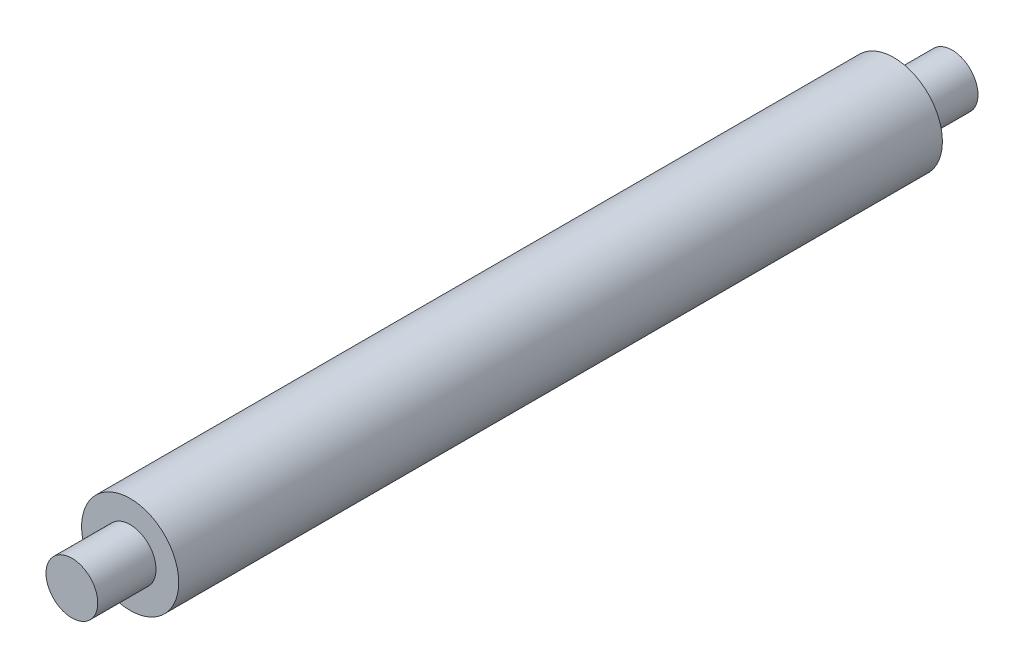
ISO-10303-21;
HEADER;
FILE_DESCRIPTION(('STEP AP214'),'2;1');
FILE_NAME('part.step','',(''),(''),'','','');
FILE_SCHEMA(('AUTOMOTIVE_DESIGN { 1 0 10303 214 1 1 1 1 }'));
ENDSEC;
DATA;
#1=APPLICATION_CONTEXT('core data for automotive mechanical design processes');
#2=APPLICATION_PROTOCOL_DEFINITION('international standard','automotive_design',2000,#1);
#3=PRODUCT_CONTEXT('',#1,'mechanical');
#4=PRODUCT('Part','Part','',(#3));
#5=PRODUCT_RELATED_PRODUCT_CATEGORY('part','',(#4));
#6=PRODUCT_DEFINITION_FORMATION('','',#4);
#7=PRODUCT_DEFINITION_CONTEXT('part definition',#1,'design');
#8=PRODUCT_DEFINITION('design','',#6,#7);
#9=PRODUCT_DEFINITION_SHAPE('','',#8);
#10=(LENGTH_UNIT() NAMED_UNIT(*) SI_UNIT(.MILLI.,.METRE.));
#11=(NAMED_UNIT(*) PLANE_ANGLE_UNIT() SI_UNIT($,.RADIAN.));
#12=(NAMED_UNIT(*) SI_UNIT($,.STERADIAN.) SOLID_ANGLE_UNIT());
#13=UNCERTAINTY_MEASURE_WITH_UNIT(LENGTH_MEASURE(1.E-05),#10,'distance_accuracy_value','');
#14=(GEOMETRIC_REPRESENTATION_CONTEXT(3) GLOBAL_UNCERTAINTY_ASSIGNED_CONTEXT((#13)) GLOBAL_UNIT_ASSIGNED_CONTEXT((#10,
#11,#12)) REPRESENTATION_CONTEXT('',''));
#15=CARTESIAN_POINT('',(0.,0.,0.));
#16=DIRECTION('',(0.,0.,1.));
#17=DIRECTION('',(1.,0.,0.));
#18=AXIS2_PLACEMENT_3D('',#15,#16,#17);
#19=CARTESIAN_POINT('',(0.,0.,295.));
#20=DIRECTION('',(0.,0.,-1.));
#21=DIRECTION('',(-1.,0.,0.));
#22=AXIS2_PLACEMENT_3D('',#19,#20,#21);
#23=CYLINDRICAL_SURFACE('',#22,37.5);
#24=CARTESIAN_POINT('',(0.,0.,295.));
#25=DIRECTION('',(0.,0.,1.));
#26=DIRECTION('',(1.,0.,0.));
#27=AXIS2_PLACEMENT_3D('',#24,#25,#26);
#28=CIRCLE('',#27,37.5);
#29=CARTESIAN_POINT('',(37.5,0.,295.));
#30=VERTEX_POINT('',#29);
#31=EDGE_CURVE('E45',#30,#30,#28,.T.);
#32=ORIENTED_EDGE('',*,*,#31,.F.);
#33=EDGE_LOOP('',(#32));
#34=FACE_BOUND('',#33,.T.);
#35=CARTESIAN_POINT('',(0.,0.,-295.));
#36=DIRECTION('',(0.,0.,1.));
#37=DIRECTION('',(1.,0.,0.));
#38=AXIS2_PLACEMENT_3D('',#35,#36,#37);
#39=CIRCLE('',#38,37.5);
#40=CARTESIAN_POINT('',(37.5,0.,-295.));
#41=VERTEX_POINT('',#40);
#42=EDGE_CURVE('E36',#41,#41,#39,.T.);
#43=ORIENTED_EDGE('',*,*,#42,.T.);
#44=EDGE_LOOP('',(#43));
#45=FACE_BOUND('',#44,.T.);
#46=ADVANCED_FACE('F33',(#34,#45),#23,.T.);
#47=CARTESIAN_POINT('',(0.,0.,295.));
#48=DIRECTION('',(0.,0.,1.));
#49=DIRECTION('',(1.,0.,0.));
#50=AXIS2_PLACEMENT_3D('',#47,#48,#49);
#51=PLANE('',#50);
#52=CARTESIAN_POINT('',(0.,0.,295.));
#53=DIRECTION('',(0.,0.,1.));
#54=DIRECTION('',(1.,0.,0.));
#55=AXIS2_PLACEMENT_3D('',#52,#53,#54);
#56=CIRCLE('',#55,20.);
#57=CARTESIAN_POINT('',(-20.,0.,295.));
#58=VERTEX_POINT('',#57);
#59=EDGE_CURVE('E40',#58,#58,#56,.T.);
#60=ORIENTED_EDGE('',*,*,#59,.F.);
#61=EDGE_LOOP('',(#60));
#62=FACE_BOUND('',#61,.T.);
#63=ORIENTED_EDGE('',*,*,#31,.T.);
#64=EDGE_LOOP('',(#63));
#65=FACE_BOUND('',#64,.T.);
#66=ADVANCED_FACE('F62',(#62,#65),#51,.T.);
#67=CARTESIAN_POINT('',(0.,0.,-295.));
#68=DIRECTION('',(0.,0.,1.));
#69=DIRECTION('',(1.,0.,0.));
#70=AXIS2_PLACEMENT_3D('',#67,#68,#69);
#71=PLANE('',#70);
#72=CARTESIAN_POINT('',(0.,0.,-295.));
#73=DIRECTION('',(0.,0.,-1.));
#74=DIRECTION('',(-1.,0.,0.));
#75=AXIS2_PLACEMENT_3D('',#72,#73,#74);
#76=CIRCLE('',#75,20.);
#77=CARTESIAN_POINT('',(20.,0.,-295.));
#78=VERTEX_POINT('',#77);
#79=EDGE_CURVE('E10',#78,#78,#76,.T.);
#80=ORIENTED_EDGE('',*,*,#79,.F.);
#81=EDGE_LOOP('',(#80));
#82=FACE_BOUND('',#81,.T.);
#83=ORIENTED_EDGE('',*,*,#42,.F.);
#84=EDGE_LOOP('',(#83));
#85=FACE_BOUND('',#84,.T.);
#86=ADVANCED_FACE('F59',(#82,#85),#71,.F.);
#87=CARTESIAN_POINT('',(0.,0.,340.));
#88=DIRECTION('',(0.,0.,-1.));
#89=DIRECTION('',(-1.,0.,0.));
#90=AXIS2_PLACEMENT_3D('',#87,#88,#89);
#91=CYLINDRICAL_SURFACE('',#90,20.);
#92=CARTESIAN_POINT('',(0.,0.,340.));
#93=DIRECTION('',(0.,0.,1.));
#94=DIRECTION('',(1.,0.,0.));
#95=AXIS2_PLACEMENT_3D('',#92,#93,#94);
#96=CIRCLE('',#95,20.);
#97=CARTESIAN_POINT('',(-20.,0.,340.));
#98=VERTEX_POINT('',#97);
#99=EDGE_CURVE('E50',#98,#98,#96,.T.);
#100=CARTESIAN_POINT('',(-20.,0.,340.));
#101=CARTESIAN_POINT('',(-20.,0.,339.53125));
#102=CARTESIAN_POINT('',(-20.,0.,339.0625));
#103=CARTESIAN_POINT('',(-20.,0.,338.125));
#104=CARTESIAN_POINT('',(-20.,0.,337.65625));
#105=CARTESIAN_POINT('',(-20.,0.,336.71875));
#106=CARTESIAN_POINT('',(-20.,0.,336.25));
#107=CARTESIAN_POINT('',(-20.,0.,335.3125));
#108=CARTESIAN_POINT('',(-20.,0.,334.84375));
#109=CARTESIAN_POINT('',(-20.,0.,333.90625));
#110=CARTESIAN_POINT('',(-20.,0.,333.4375));
#111=CARTESIAN_POINT('',(-20.,0.,332.5));
#112=CARTESIAN_POINT('',(-20.,0.,332.03125));
#113=CARTESIAN_POINT('',(-20.,0.,331.09375));
#114=CARTESIAN_POINT('',(-20.,0.,330.625));
#115=CARTESIAN_POINT('',(-20.,0.,329.6875));
#116=CARTESIAN_POINT('',(-20.,0.,329.21875));
#117=CARTESIAN_POINT('',(-20.,0.,328.28125));
#118=CARTESIAN_POINT('',(-20.,0.,327.8125));
#119=CARTESIAN_POINT('',(-20.,0.,326.875));
#120=CARTESIAN_POINT('',(-20.,0.,326.40625));
#121=CARTESIAN_POINT('',(-20.,0.,325.46875));
#122=CARTESIAN_POINT('',(-20.,0.,325.));
#123=CARTESIAN_POINT('',(-20.,0.,324.0625));
#124=CARTESIAN_POINT('',(-20.,0.,323.59375));
#125=CARTESIAN_POINT('',(-20.,0.,322.65625));
#126=CARTESIAN_POINT('',(-20.,0.,322.1875));
#127=CARTESIAN_POINT('',(-20.,0.,321.25));
#128=CARTESIAN_POINT('',(-20.,0.,320.78125));
#129=CARTESIAN_POINT('',(-20.,0.,319.84375));
#130=CARTESIAN_POINT('',(-20.,0.,319.375));
#131=CARTESIAN_POINT('',(-20.,0.,318.4375));
#132=CARTESIAN_POINT('',(-20.,0.,317.96875));
#133=CARTESIAN_POINT('',(-20.,0.,317.03125));
#134=CARTESIAN_POINT('',(-20.,0.,316.5625));
#135=CARTESIAN_POINT('',(-20.,0.,315.625));
#136=CARTESIAN_POINT('',(-20.,0.,315.15625));
#137=CARTESIAN_POINT('',(-20.,0.,314.21875));
#138=CARTESIAN_POINT('',(-20.,0.,313.75));
#139=CARTESIAN_POINT('',(-20.,0.,312.8125));
#140=CARTESIAN_POINT('',(-20.,0.,312.34375));
#141=CARTESIAN_POINT('',(-20.,0.,311.40625));
#142=CARTESIAN_POINT('',(-20.,0.,310.9375));
#143=CARTESIAN_POINT('',(-20.,0.,310.));
#144=CARTESIAN_POINT('',(-20.,0.,309.53125));
#145=CARTESIAN_POINT('',(-20.,0.,308.59375));
#146=CARTESIAN_POINT('',(-20.,0.,308.125));
#147=CARTESIAN_POINT('',(-20.,0.,307.1875));
#148=CARTESIAN_POINT('',(-20.,0.,306.71875));
#149=CARTESIAN_POINT('',(-20.,0.,305.78125));
#150=CARTESIAN_POINT('',(-20.,0.,305.3125));
#151=CARTESIAN_POINT('',(-20.,0.,304.375));
#152=CARTESIAN_POINT('',(-20.,0.,303.90625));
#153=CARTESIAN_POINT('',(-20.,0.,302.96875));
#154=CARTESIAN_POINT('',(-20.,0.,302.5));
#155=CARTESIAN_POINT('',(-20.,0.,301.5625));
#156=CARTESIAN_POINT('',(-20.,0.,301.09375));
#157=CARTESIAN_POINT('',(-20.,0.,300.15625));
#158=CARTESIAN_POINT('',(-20.,0.,299.6875));
#159=CARTESIAN_POINT('',(-20.,0.,298.75));
#160=CARTESIAN_POINT('',(-20.,0.,298.28125));
#161=CARTESIAN_POINT('',(-20.,0.,297.34375));
#162=CARTESIAN_POINT('',(-20.,0.,296.875));
#163=CARTESIAN_POINT('',(-20.,0.,295.9375));
#164=CARTESIAN_POINT('',(-20.,0.,295.46875));
#165=CARTESIAN_POINT('',(-20.,0.,295.));
#166=B_SPLINE_CURVE_WITH_KNOTS('',3,(#100,#101,#102,#103,#104,#105,#106,#107,#108,#109,#110,
#111,#112,#113,#114,#115,#116,#117,#118,#119,#120,#121,#122,#123,#124,#125,#126,#127,#128,#129,
#130,#131,#132,#133,#134,#135,#136,#137,#138,#139,#140,#141,#142,#143,#144,#145,#146,#147,#148,
#149,#150,#151,#152,#153,#154,#155,#156,#157,#158,#159,#160,#161,#162,#163,#164,#165),
.UNSPECIFIED.,.F.,.F.,(4,2,2,2,2,2,2,2,2,2,2,2,2,2,2,2,2,2,2,2,2,2,2,2,2,2,2,2,2,2,2,2,4),(0.,
1.40625,2.8125,4.21874999999999,5.62499999999999,7.03124999999999,8.43749999999999,
9.84374999999998,11.25,12.65625,14.0625,15.46875,16.875,18.28125,19.6875,21.09375,22.5,23.90625,
25.3125,26.71875,28.125,29.53125,30.9375,32.34375,33.7499999999999,35.1562499999999,
36.5624999999999,37.9687499999999,39.3749999999999,40.7812499999999,42.1874999999999,
43.5937499999999,44.9999999999999),.UNSPECIFIED.);
#167=EDGE_CURVE('BSEAM61',#98,#58,#166,.T.);
#168=ORIENTED_EDGE('',*,*,#99,.F.);
#169=ORIENTED_EDGE('',*,*,#59,.T.);
#170=ORIENTED_EDGE('',*,*,#167,.T.);
#171=ORIENTED_EDGE('',*,*,#167,.F.);
#172=EDGE_LOOP('',(#168,#170,#169,#171));
#173=FACE_BOUND('',#172,.T.);
#174=ADVANCED_FACE('F61',(#173),#91,.T.);
#175=CARTESIAN_POINT('',(0.,0.,340.));
#176=DIRECTION('',(0.,0.,1.));
#177=DIRECTION('',(1.,0.,0.));
#178=AXIS2_PLACEMENT_3D('',#175,#176,#177);
#179=PLANE('',#178);
#180=ORIENTED_EDGE('',*,*,#99,.T.);
#181=EDGE_LOOP('',(#180));
#182=FACE_BOUND('',#181,.T.);
#183=ADVANCED_FACE('F68',(#182),#179,.T.);
#184=CARTESIAN_POINT('',(0.,0.,-340.));
#185=DIRECTION('',(0.,0.,1.));
#186=DIRECTION('',(1.,0.,0.));
#187=AXIS2_PLACEMENT_3D('',#184,#185,#186);
#188=CYLINDRICAL_SURFACE('',#187,20.);
#189=CARTESIAN_POINT('',(0.,0.,-340.));
#190=DIRECTION('',(0.,0.,-1.));
#191=DIRECTION('',(-1.,0.,0.));
#192=AXIS2_PLACEMENT_3D('',#189,#190,#191);
#193=CIRCLE('',#192,20.);
#194=CARTESIAN_POINT('',(20.,0.,-340.));
#195=VERTEX_POINT('',#194);
#196=EDGE_CURVE('E49',#195,#195,#193,.T.);
#197=CARTESIAN_POINT('',(20.,0.,-340.));
#198=CARTESIAN_POINT('',(20.,0.,-339.53125));
#199=CARTESIAN_POINT('',(20.,0.,-339.0625));
#200=CARTESIAN_POINT('',(20.,0.,-338.125));
#201=CARTESIAN_POINT('',(20.,0.,-337.65625));
#202=CARTESIAN_POINT('',(20.,0.,-336.71875));
#203=CARTESIAN_POINT('',(20.,0.,-336.25));
#204=CARTESIAN_POINT('',(20.,0.,-335.3125));
#205=CARTESIAN_POINT('',(20.,0.,-334.84375));
#206=CARTESIAN_POINT('',(20.,0.,-333.90625));
#207=CARTESIAN_POINT('',(20.,0.,-333.4375));
#208=CARTESIAN_POINT('',(20.,0.,-332.5));
#209=CARTESIAN_POINT('',(20.,0.,-332.03125));
#210=CARTESIAN_POINT('',(20.,0.,-331.09375));
#211=CARTESIAN_POINT('',(20.,0.,-330.625));
#212=CARTESIAN_POINT('',(20.,0.,-329.6875));
#213=CARTESIAN_POINT('',(20.,0.,-329.21875));
#214=CARTESIAN_POINT('',(20.,0.,-328.28125));
#215=CARTESIAN_POINT('',(20.,0.,-327.8125));
#216=CARTESIAN_POINT('',(20.,0.,-326.875));
#217=CARTESIAN_POINT('',(20.,0.,-326.40625));
#218=CARTESIAN_POINT('',(20.,0.,-325.46875));
#219=CARTESIAN_POINT('',(20.,0.,-325.));
#220=CARTESIAN_POINT('',(20.,0.,-324.0625));
#221=CARTESIAN_POINT('',(20.,0.,-323.59375));
#222=CARTESIAN_POINT('',(20.,0.,-322.65625));
#223=CARTESIAN_POINT('',(20.,0.,-322.1875));
#224=CARTESIAN_POINT('',(20.,0.,-321.25));
#225=CARTESIAN_POINT('',(20.,0.,-320.78125));
#226=CARTESIAN_POINT('',(20.,0.,-319.84375));
#227=CARTESIAN_POINT('',(20.,0.,-319.375));
#228=CARTESIAN_POINT('',(20.,0.,-318.4375));
#229=CARTESIAN_POINT('',(20.,0.,-317.96875));
#230=CARTESIAN_POINT('',(20.,0.,-317.03125));
#231=CARTESIAN_POINT('',(20.,0.,-316.5625));
#232=CARTESIAN_POINT('',(20.,0.,-315.625));
#233=CARTESIAN_POINT('',(20.,0.,-315.15625));
#234=CARTESIAN_POINT('',(20.,0.,-314.21875));
#235=CARTESIAN_POINT('',(20.,0.,-313.75));
#236=CARTESIAN_POINT('',(20.,0.,-312.8125));
#237=CARTESIAN_POINT('',(20.,0.,-312.34375));
#238=CARTESIAN_POINT('',(20.,0.,-311.40625));
#239=CARTESIAN_POINT('',(20.,0.,-310.9375));
#240=CARTESIAN_POINT('',(20.,0.,-310.));
#241=CARTESIAN_POINT('',(20.,0.,-309.53125));
#242=CARTESIAN_POINT('',(20.,0.,-308.59375));
#243=CARTESIAN_POINT('',(20.,0.,-308.125));
#244=CARTESIAN_POINT('',(20.,0.,-307.1875));
#245=CARTESIAN_POINT('',(20.,0.,-306.71875));
#246=CARTESIAN_POINT('',(20.,0.,-305.78125));
#247=CARTESIAN_POINT('',(20.,0.,-305.3125));
#248=CARTESIAN_POINT('',(20.,0.,-304.375));
#249=CARTESIAN_POINT('',(20.,0.,-303.90625));
#250=CARTESIAN_POINT('',(20.,0.,-302.96875));
#251=CARTESIAN_POINT('',(20.,0.,-302.5));
#252=CARTESIAN_POINT('',(20.,0.,-301.5625));
#253=CARTESIAN_POINT('',(20.,0.,-301.09375));
#254=CARTESIAN_POINT('',(20.,0.,-300.15625));
#255=CARTESIAN_POINT('',(20.,0.,-299.6875));
#256=CARTESIAN_POINT('',(20.,0.,-298.75));
#257=CARTESIAN_POINT('',(20.,0.,-298.28125));
#258=CARTESIAN_POINT('',(20.,0.,-297.34375));
#259=CARTESIAN_POINT('',(20.,0.,-296.875));
#260=CARTESIAN_POINT('',(20.,0.,-295.9375));
#261=CARTESIAN_POINT('',(20.,0.,-295.46875));
#262=CARTESIAN_POINT('',(20.,0.,-295.));
#263=B_SPLINE_CURVE_WITH_KNOTS('',3,(#197,#198,#199,#200,#201,#202,#203,#204,#205,#206,#207,
#208,#209,#210,#211,#212,#213,#214,#215,#216,#217,#218,#219,#220,#221,#222,#223,#224,#225,#226,
#227,#228,#229,#230,#231,#232,#233,#234,#235,#236,#237,#238,#239,#240,#241,#242,#243,#244,#245,
#246,#247,#248,#249,#250,#251,#252,#253,#254,#255,#256,#257,#258,#259,#260,#261,#262),
.UNSPECIFIED.,.F.,.F.,(4,2,2,2,2,2,2,2,2,2,2,2,2,2,2,2,2,2,2,2,2,2,2,2,2,2,2,2,2,2,2,2,4),(0.,
1.40625,2.8125,4.21874999999999,5.62499999999999,7.03124999999999,8.43749999999999,
9.84374999999998,11.25,12.65625,14.0625,15.46875,16.875,18.28125,19.6875,21.09375,22.5,23.90625,
25.3125,26.71875,28.125,29.53125,30.9375,32.34375,33.7499999999999,35.1562499999999,
36.5624999999999,37.9687499999999,39.3749999999999,40.7812499999999,42.1874999999999,
43.5937499999999,44.9999999999999),.UNSPECIFIED.);
#264=EDGE_CURVE('BSEAM96',#195,#78,#263,.T.);
#265=ORIENTED_EDGE('',*,*,#196,.F.);
#266=ORIENTED_EDGE('',*,*,#79,.T.);
#267=ORIENTED_EDGE('',*,*,#264,.T.);
#268=ORIENTED_EDGE('',*,*,#264,.F.);
#269=EDGE_LOOP('',(#265,#267,#266,#268));
#270=FACE_BOUND('',#269,.T.);
#271=ADVANCED_FACE('F96',(#270),#188,.T.);
#272=CARTESIAN_POINT('',(0.,0.,-340.));
#273=DIRECTION('',(0.,0.,-1.));
#274=DIRECTION('',(-1.,0.,0.));
#275=AXIS2_PLACEMENT_3D('',#272,#273,#274);
#276=PLANE('',#275);
#277=ORIENTED_EDGE('',*,*,#196,.T.);
#278=EDGE_LOOP('',(#277));
#279=FACE_BOUND('',#278,.T.);
#280=ADVANCED_FACE('F110',(#279),#276,.T.);
#281=CLOSED_SHELL('',(#46,#66,#86,#174,#183,#271,#280));
#282=MANIFOLD_SOLID_BREP('B2',#281);
#283=ADVANCED_BREP_SHAPE_REPRESENTATION('',(#18,#282),#14);
#284=SHAPE_DEFINITION_REPRESENTATION(#9,#283);
ENDSEC;
END-ISO-10303-21;
